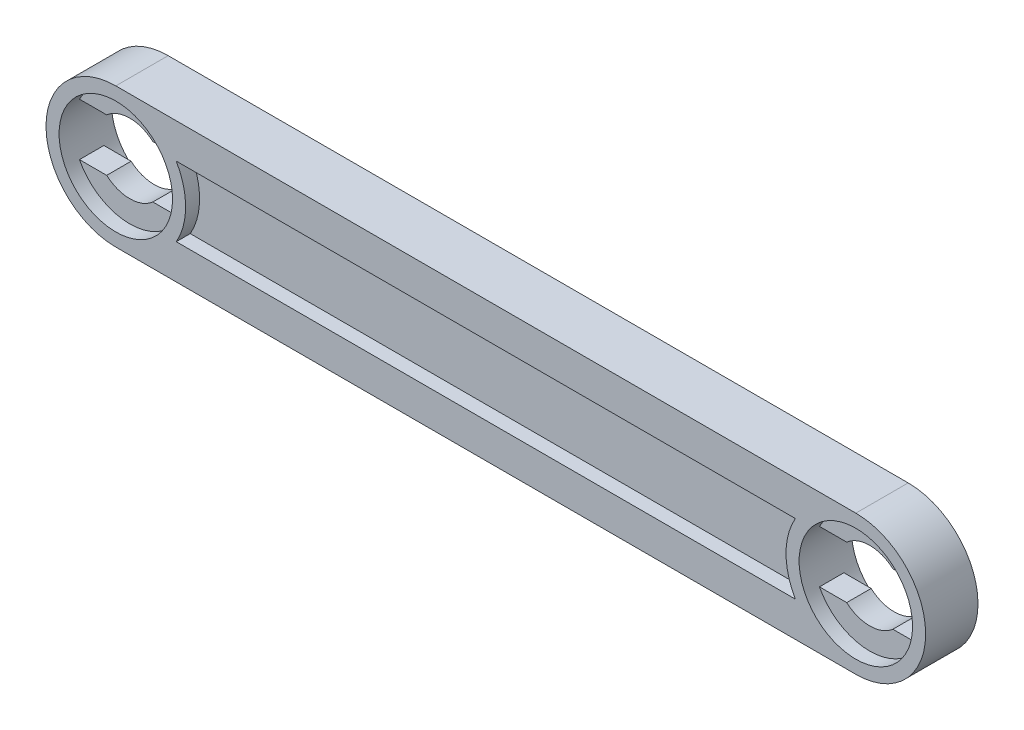
ISO-10303-21;
HEADER;
FILE_DESCRIPTION(('STEP AP214'),'2;1');
FILE_NAME('part.step','',(''),(''),'','','');
FILE_SCHEMA(('AUTOMOTIVE_DESIGN { 1 0 10303 214 1 1 1 1 }'));
ENDSEC;
DATA;
#1=APPLICATION_CONTEXT('core data for automotive mechanical design processes');
#2=APPLICATION_PROTOCOL_DEFINITION('international standard','automotive_design',2000,#1);
#3=PRODUCT_CONTEXT('',#1,'mechanical');
#4=PRODUCT('Part','Part','',(#3));
#5=PRODUCT_RELATED_PRODUCT_CATEGORY('part','',(#4));
#6=PRODUCT_DEFINITION_FORMATION('','',#4);
#7=PRODUCT_DEFINITION_CONTEXT('part definition',#1,'design');
#8=PRODUCT_DEFINITION('design','',#6,#7);
#9=PRODUCT_DEFINITION_SHAPE('','',#8);
#10=(LENGTH_UNIT() NAMED_UNIT(*) SI_UNIT(.MILLI.,.METRE.));
#11=(NAMED_UNIT(*) PLANE_ANGLE_UNIT() SI_UNIT($,.RADIAN.));
#12=(NAMED_UNIT(*) SI_UNIT($,.STERADIAN.) SOLID_ANGLE_UNIT());
#13=UNCERTAINTY_MEASURE_WITH_UNIT(LENGTH_MEASURE(1.E-05),#10,'distance_accuracy_value','');
#14=(GEOMETRIC_REPRESENTATION_CONTEXT(3) GLOBAL_UNCERTAINTY_ASSIGNED_CONTEXT((#13)) GLOBAL_UNIT_ASSIGNED_CONTEXT((#10,
#11,#12)) REPRESENTATION_CONTEXT('',''));
#15=CARTESIAN_POINT('',(0.,0.,0.));
#16=DIRECTION('',(0.,0.,1.));
#17=DIRECTION('',(1.,0.,0.));
#18=AXIS2_PLACEMENT_3D('',#15,#16,#17);
#19=CARTESIAN_POINT('',(0.,0.,-3.));
#20=DIRECTION('',(0.,0.,1.));
#21=DIRECTION('',(1.,0.,0.));
#22=AXIS2_PLACEMENT_3D('',#19,#20,#21);
#23=PLANE('',#22);
#24=DIRECTION('',(0.,-1.,0.));
#25=VECTOR('',#24,1.);
#26=CARTESIAN_POINT('',(38.4,-2.,-3.));
#27=LINE('',#26,#25);
#28=CARTESIAN_POINT('',(38.4,2.,-3.));
#29=VERTEX_POINT('',#28);
#30=CARTESIAN_POINT('',(38.4,-2.,-3.));
#31=VERTEX_POINT('',#30);
#32=EDGE_CURVE('E248',#29,#31,#27,.T.);
#33=ORIENTED_EDGE('',*,*,#32,.F.);
#34=DIRECTION('',(1.,0.,0.));
#35=VECTOR('',#34,1.);
#36=CARTESIAN_POINT('',(38.4,2.,-3.));
#37=LINE('',#36,#35);
#38=CARTESIAN_POINT('',(4.,2.,-3.));
#39=VERTEX_POINT('',#38);
#40=EDGE_CURVE('E49',#39,#29,#37,.T.);
#41=ORIENTED_EDGE('',*,*,#40,.F.);
#42=DIRECTION('',(0.,1.,0.));
#43=VECTOR('',#42,1.);
#44=CARTESIAN_POINT('',(4.00000000000003,-2.,-3.));
#45=LINE('',#44,#43);
#46=CARTESIAN_POINT('',(4.00000000000003,-2.,-3.));
#47=VERTEX_POINT('',#46);
#48=EDGE_CURVE('E239',#47,#39,#45,.T.);
#49=ORIENTED_EDGE('',*,*,#48,.F.);
#50=DIRECTION('',(-1.,0.,0.));
#51=VECTOR('',#50,1.);
#52=CARTESIAN_POINT('',(38.4,-2.,-3.));
#53=LINE('',#52,#51);
#54=EDGE_CURVE('E242',#31,#47,#53,.T.);
#55=ORIENTED_EDGE('',*,*,#54,.F.);
#56=EDGE_LOOP('',(#33,#41,#49,#55));
#57=FACE_BOUND('',#56,.T.);
#58=CARTESIAN_POINT('',(0.,0.,-3.));
#59=DIRECTION('',(0.,0.,1.));
#60=DIRECTION('',(1.,0.,0.));
#61=AXIS2_PLACEMENT_3D('',#58,#59,#60);
#62=CIRCLE('',#61,4.);
#63=CARTESIAN_POINT('',(0.,4.,-3.));
#64=VERTEX_POINT('',#63);
#65=CARTESIAN_POINT('',(0.,-4.,-3.));
#66=VERTEX_POINT('',#65);
#67=EDGE_CURVE('E414',#64,#66,#62,.T.);
#68=ORIENTED_EDGE('',*,*,#67,.F.);
#69=DIRECTION('',(-1.,0.,0.));
#70=VECTOR('',#69,1.);
#71=CARTESIAN_POINT('',(0.,4.,-3.));
#72=LINE('',#71,#70);
#73=CARTESIAN_POINT('',(42.4,4.,-3.));
#74=VERTEX_POINT('',#73);
#75=EDGE_CURVE('E424',#74,#64,#72,.T.);
#76=ORIENTED_EDGE('',*,*,#75,.F.);
#77=CARTESIAN_POINT('',(42.4,0.,-3.));
#78=DIRECTION('',(0.,0.,1.));
#79=DIRECTION('',(1.,0.,0.));
#80=AXIS2_PLACEMENT_3D('',#77,#78,#79);
#81=CIRCLE('',#80,4.);
#82=CARTESIAN_POINT('',(42.4,-4.,-3.));
#83=VERTEX_POINT('',#82);
#84=EDGE_CURVE('E421',#83,#74,#81,.T.);
#85=ORIENTED_EDGE('',*,*,#84,.F.);
#86=DIRECTION('',(1.,0.,0.));
#87=VECTOR('',#86,1.);
#88=CARTESIAN_POINT('',(0.,-4.,-3.));
#89=LINE('',#88,#87);
#90=EDGE_CURVE('E417',#66,#83,#89,.T.);
#91=ORIENTED_EDGE('',*,*,#90,.F.);
#92=EDGE_LOOP('',(#68,#76,#85,#91));
#93=FACE_BOUND('',#92,.T.);
#94=CARTESIAN_POINT('',(0.,0.,-3.));
#95=DIRECTION('',(0.,0.,1.));
#96=DIRECTION('',(1.,0.,0.));
#97=AXIS2_PLACEMENT_3D('',#94,#95,#96);
#98=CIRCLE('',#97,3.25);
#99=CARTESIAN_POINT('',(3.25,0.,-3.));
#100=VERTEX_POINT('',#99);
#101=EDGE_CURVE('E391',#100,#100,#98,.F.);
#102=ORIENTED_EDGE('',*,*,#101,.F.);
#103=EDGE_LOOP('',(#102));
#104=FACE_BOUND('',#103,.T.);
#105=CARTESIAN_POINT('',(42.4,0.,-3.));
#106=DIRECTION('',(0.,0.,1.));
#107=DIRECTION('',(1.,0.,0.));
#108=AXIS2_PLACEMENT_3D('',#105,#106,#107);
#109=CIRCLE('',#108,3.25);
#110=CARTESIAN_POINT('',(45.65,0.,-3.));
#111=VERTEX_POINT('',#110);
#112=EDGE_CURVE('E328',#111,#111,#109,.F.);
#113=ORIENTED_EDGE('',*,*,#112,.F.);
#114=EDGE_LOOP('',(#113));
#115=FACE_BOUND('',#114,.T.);
#116=ADVANCED_FACE('F34',(#57,#93,#104,#115),#23,.F.);
#117=CARTESIAN_POINT('',(39.5168593513323,1.5,-3.001));
#118=DIRECTION('',(0.,1.,0.));
#119=DIRECTION('',(0.,0.,1.));
#120=AXIS2_PLACEMENT_3D('',#117,#118,#119);
#121=PLANE('',#120);
#122=DIRECTION('',(0.,0.,1.));
#123=VECTOR('',#122,1.);
#124=CARTESIAN_POINT('',(39.5168593513323,1.5,-3.001));
#125=LINE('',#124,#123);
#126=CARTESIAN_POINT('',(39.5168593513323,1.5,-2.2));
#127=VERTEX_POINT('',#126);
#128=CARTESIAN_POINT('',(39.5168593513323,1.5,-0.8));
#129=VERTEX_POINT('',#128);
#130=EDGE_CURVE('E335',#127,#129,#125,.T.);
#131=ORIENTED_EDGE('',*,*,#130,.F.);
#132=DIRECTION('',(1.,0.,0.));
#133=VECTOR('',#132,1.);
#134=CARTESIAN_POINT('',(39.5168593513323,1.5,-2.2));
#135=LINE('',#134,#133);
#136=CARTESIAN_POINT('',(41.0771243444677,1.5,-2.2));
#137=VERTEX_POINT('',#136);
#138=EDGE_CURVE('E306',#127,#137,#135,.T.);
#139=ORIENTED_EDGE('',*,*,#138,.T.);
#140=DIRECTION('',(0.,0.,1.));
#141=VECTOR('',#140,1.);
#142=CARTESIAN_POINT('',(41.0771243444677,1.5,-3.001));
#143=LINE('',#142,#141);
#144=CARTESIAN_POINT('',(41.0771243444677,1.5,-0.8));
#145=VERTEX_POINT('',#144);
#146=EDGE_CURVE('E338',#137,#145,#143,.T.);
#147=ORIENTED_EDGE('',*,*,#146,.T.);
#148=DIRECTION('',(1.,0.,0.));
#149=VECTOR('',#148,1.);
#150=CARTESIAN_POINT('',(39.5168593513323,1.5,-0.8));
#151=LINE('',#150,#149);
#152=EDGE_CURVE('E325',#129,#145,#151,.T.);
#153=ORIENTED_EDGE('',*,*,#152,.F.);
#154=EDGE_LOOP('',(#131,#139,#147,#153));
#155=FACE_BOUND('',#154,.T.);
#156=ADVANCED_FACE('F483',(#155),#121,.F.);
#157=CARTESIAN_POINT('',(42.4,0.,-3.001));
#158=DIRECTION('',(0.,0.,1.));
#159=DIRECTION('',(1.,0.,0.));
#160=AXIS2_PLACEMENT_3D('',#157,#158,#159);
#161=CYLINDRICAL_SURFACE('',#160,2.);
#162=ORIENTED_EDGE('',*,*,#146,.F.);
#163=CARTESIAN_POINT('',(42.4,0.,-2.2));
#164=DIRECTION('',(0.,0.,1.));
#165=DIRECTION('',(1.,0.,0.));
#166=AXIS2_PLACEMENT_3D('',#163,#164,#165);
#167=CIRCLE('',#166,2.);
#168=CARTESIAN_POINT('',(43.7228756555323,1.5,-2.2));
#169=VERTEX_POINT('',#168);
#170=EDGE_CURVE('E303',#137,#169,#167,.F.);
#171=ORIENTED_EDGE('',*,*,#170,.T.);
#172=DIRECTION('',(0.,0.,1.));
#173=VECTOR('',#172,1.);
#174=CARTESIAN_POINT('',(43.7228756555323,1.5,-3.001));
#175=LINE('',#174,#173);
#176=CARTESIAN_POINT('',(43.7228756555323,1.5,-0.800000000000001));
#177=VERTEX_POINT('',#176);
#178=EDGE_CURVE('E340',#169,#177,#175,.T.);
#179=ORIENTED_EDGE('',*,*,#178,.T.);
#180=CARTESIAN_POINT('',(42.4,0.,-0.8));
#181=DIRECTION('',(0.,0.,1.));
#182=DIRECTION('',(1.,0.,0.));
#183=AXIS2_PLACEMENT_3D('',#180,#181,#182);
#184=CIRCLE('',#183,2.);
#185=EDGE_CURVE('E322',#145,#177,#184,.F.);
#186=ORIENTED_EDGE('',*,*,#185,.F.);
#187=EDGE_LOOP('',(#162,#171,#179,#186));
#188=FACE_BOUND('',#187,.T.);
#189=ADVANCED_FACE('F489',(#188),#161,.F.);
#190=CARTESIAN_POINT('',(43.7228756555323,1.5,-3.001));
#191=DIRECTION('',(0.,1.,0.));
#192=DIRECTION('',(0.,0.,1.));
#193=AXIS2_PLACEMENT_3D('',#190,#191,#192);
#194=PLANE('',#193);
#195=ORIENTED_EDGE('',*,*,#178,.F.);
#196=DIRECTION('',(1.,0.,0.));
#197=VECTOR('',#196,1.);
#198=CARTESIAN_POINT('',(43.7228756555323,1.5,-2.2));
#199=LINE('',#198,#197);
#200=CARTESIAN_POINT('',(45.2831406486677,1.5,-2.2));
#201=VERTEX_POINT('',#200);
#202=EDGE_CURVE('E300',#169,#201,#199,.T.);
#203=ORIENTED_EDGE('',*,*,#202,.T.);
#204=DIRECTION('',(0.,0.,1.));
#205=VECTOR('',#204,1.);
#206=CARTESIAN_POINT('',(45.2831406486677,1.5,-3.001));
#207=LINE('',#206,#205);
#208=CARTESIAN_POINT('',(45.2831406486677,1.5,-0.8));
#209=VERTEX_POINT('',#208);
#210=EDGE_CURVE('E342',#201,#209,#207,.T.);
#211=ORIENTED_EDGE('',*,*,#210,.T.);
#212=DIRECTION('',(1.,0.,0.));
#213=VECTOR('',#212,1.);
#214=CARTESIAN_POINT('',(43.7228756555323,1.5,-0.8));
#215=LINE('',#214,#213);
#216=EDGE_CURVE('E319',#177,#209,#215,.T.);
#217=ORIENTED_EDGE('',*,*,#216,.F.);
#218=EDGE_LOOP('',(#195,#203,#211,#217));
#219=FACE_BOUND('',#218,.T.);
#220=ADVANCED_FACE('F660',(#219),#194,.F.);
#221=CARTESIAN_POINT('',(43.7228756555323,-1.5,-3.001));
#222=DIRECTION('',(0.,-1.,0.));
#223=DIRECTION('',(0.,0.,-1.));
#224=AXIS2_PLACEMENT_3D('',#221,#222,#223);
#225=PLANE('',#224);
#226=DIRECTION('',(0.,0.,1.));
#227=VECTOR('',#226,1.);
#228=CARTESIAN_POINT('',(45.2831406486677,-1.5,-3.001));
#229=LINE('',#228,#227);
#230=CARTESIAN_POINT('',(45.2831406486677,-1.5,-2.2));
#231=VERTEX_POINT('',#230);
#232=CARTESIAN_POINT('',(45.2831406486677,-1.5,-0.8));
#233=VERTEX_POINT('',#232);
#234=EDGE_CURVE('E344',#231,#233,#229,.T.);
#235=ORIENTED_EDGE('',*,*,#234,.F.);
#236=DIRECTION('',(-1.,0.,0.));
#237=VECTOR('',#236,1.);
#238=CARTESIAN_POINT('',(43.7228756555323,-1.5,-2.2));
#239=LINE('',#238,#237);
#240=CARTESIAN_POINT('',(43.7228756555323,-1.5,-2.2));
#241=VERTEX_POINT('',#240);
#242=EDGE_CURVE('E297',#231,#241,#239,.T.);
#243=ORIENTED_EDGE('',*,*,#242,.T.);
#244=DIRECTION('',(0.,0.,1.));
#245=VECTOR('',#244,1.);
#246=CARTESIAN_POINT('',(43.7228756555323,-1.5,-3.001));
#247=LINE('',#246,#245);
#248=CARTESIAN_POINT('',(43.7228756555323,-1.5,-0.8));
#249=VERTEX_POINT('',#248);
#250=EDGE_CURVE('E346',#241,#249,#247,.T.);
#251=ORIENTED_EDGE('',*,*,#250,.T.);
#252=DIRECTION('',(-1.,0.,0.));
#253=VECTOR('',#252,1.);
#254=CARTESIAN_POINT('',(43.7228756555323,-1.5,-0.8));
#255=LINE('',#254,#253);
#256=EDGE_CURVE('E316',#233,#249,#255,.T.);
#257=ORIENTED_EDGE('',*,*,#256,.F.);
#258=EDGE_LOOP('',(#235,#243,#251,#257));
#259=FACE_BOUND('',#258,.T.);
#260=ADVANCED_FACE('F670',(#259),#225,.F.);
#261=CARTESIAN_POINT('',(42.4,0.,-3.001));
#262=DIRECTION('',(0.,0.,1.));
#263=DIRECTION('',(1.,0.,0.));
#264=AXIS2_PLACEMENT_3D('',#261,#262,#263);
#265=CYLINDRICAL_SURFACE('',#264,2.);
#266=ORIENTED_EDGE('',*,*,#250,.F.);
#267=CARTESIAN_POINT('',(42.4,0.,-2.2));
#268=DIRECTION('',(0.,0.,1.));
#269=DIRECTION('',(1.,0.,0.));
#270=AXIS2_PLACEMENT_3D('',#267,#268,#269);
#271=CIRCLE('',#270,2.);
#272=CARTESIAN_POINT('',(41.0771243444677,-1.5,-2.2));
#273=VERTEX_POINT('',#272);
#274=EDGE_CURVE('E294',#241,#273,#271,.F.);
#275=ORIENTED_EDGE('',*,*,#274,.T.);
#276=DIRECTION('',(0.,0.,1.));
#277=VECTOR('',#276,1.);
#278=CARTESIAN_POINT('',(41.0771243444677,-1.5,-3.001));
#279=LINE('',#278,#277);
#280=CARTESIAN_POINT('',(41.0771243444677,-1.5,-0.800000000000001));
#281=VERTEX_POINT('',#280);
#282=EDGE_CURVE('E348',#273,#281,#279,.T.);
#283=ORIENTED_EDGE('',*,*,#282,.T.);
#284=CARTESIAN_POINT('',(42.4,0.,-0.8));
#285=DIRECTION('',(0.,0.,1.));
#286=DIRECTION('',(1.,0.,0.));
#287=AXIS2_PLACEMENT_3D('',#284,#285,#286);
#288=CIRCLE('',#287,2.);
#289=EDGE_CURVE('E313',#249,#281,#288,.F.);
#290=ORIENTED_EDGE('',*,*,#289,.F.);
#291=EDGE_LOOP('',(#266,#275,#283,#290));
#292=FACE_BOUND('',#291,.T.);
#293=ADVANCED_FACE('F680',(#292),#265,.F.);
#294=CARTESIAN_POINT('',(39.5168593513323,-1.5,-3.001));
#295=DIRECTION('',(0.,-1.,0.));
#296=DIRECTION('',(0.,0.,-1.));
#297=AXIS2_PLACEMENT_3D('',#294,#295,#296);
#298=PLANE('',#297);
#299=ORIENTED_EDGE('',*,*,#282,.F.);
#300=DIRECTION('',(-1.,0.,0.));
#301=VECTOR('',#300,1.);
#302=CARTESIAN_POINT('',(39.5168593513323,-1.5,-2.2));
#303=LINE('',#302,#301);
#304=CARTESIAN_POINT('',(39.5168593513323,-1.5,-2.2));
#305=VERTEX_POINT('',#304);
#306=EDGE_CURVE('E291',#273,#305,#303,.T.);
#307=ORIENTED_EDGE('',*,*,#306,.T.);
#308=DIRECTION('',(0.,0.,1.));
#309=VECTOR('',#308,1.);
#310=CARTESIAN_POINT('',(39.5168593513323,-1.5,-3.001));
#311=LINE('',#310,#309);
#312=CARTESIAN_POINT('',(39.5168593513323,-1.5,-0.8));
#313=VERTEX_POINT('',#312);
#314=EDGE_CURVE('E334',#305,#313,#311,.T.);
#315=ORIENTED_EDGE('',*,*,#314,.T.);
#316=DIRECTION('',(-1.,0.,0.));
#317=VECTOR('',#316,1.);
#318=CARTESIAN_POINT('',(39.5168593513323,-1.5,-0.8));
#319=LINE('',#318,#317);
#320=EDGE_CURVE('E11',#281,#313,#319,.T.);
#321=ORIENTED_EDGE('',*,*,#320,.F.);
#322=EDGE_LOOP('',(#299,#307,#315,#321));
#323=FACE_BOUND('',#322,.T.);
#324=ADVANCED_FACE('F602',(#323),#298,.F.);
#325=CARTESIAN_POINT('',(-2.8831406486677,1.5,-3.001));
#326=DIRECTION('',(0.,1.,0.));
#327=DIRECTION('',(0.,0.,1.));
#328=AXIS2_PLACEMENT_3D('',#325,#326,#327);
#329=PLANE('',#328);
#330=DIRECTION('',(0.,0.,1.));
#331=VECTOR('',#330,1.);
#332=CARTESIAN_POINT('',(-2.8831406486677,1.5,-3.001));
#333=LINE('',#332,#331);
#334=CARTESIAN_POINT('',(-2.8831406486677,1.5,-2.2));
#335=VERTEX_POINT('',#334);
#336=CARTESIAN_POINT('',(-2.8831406486677,1.5,-0.8));
#337=VERTEX_POINT('',#336);
#338=EDGE_CURVE('E398',#335,#337,#333,.T.);
#339=ORIENTED_EDGE('',*,*,#338,.F.);
#340=DIRECTION('',(1.,0.,0.));
#341=VECTOR('',#340,1.);
#342=CARTESIAN_POINT('',(-2.8831406486677,1.5,-2.2));
#343=LINE('',#342,#341);
#344=CARTESIAN_POINT('',(-1.3228756555323,1.5,-2.2));
#345=VERTEX_POINT('',#344);
#346=EDGE_CURVE('E369',#335,#345,#343,.T.);
#347=ORIENTED_EDGE('',*,*,#346,.T.);
#348=DIRECTION('',(0.,0.,1.));
#349=VECTOR('',#348,1.);
#350=CARTESIAN_POINT('',(-1.3228756555323,1.5,-3.001));
#351=LINE('',#350,#349);
#352=CARTESIAN_POINT('',(-1.3228756555323,1.5,-0.8));
#353=VERTEX_POINT('',#352);
#354=EDGE_CURVE('E401',#345,#353,#351,.T.);
#355=ORIENTED_EDGE('',*,*,#354,.T.);
#356=DIRECTION('',(1.,0.,0.));
#357=VECTOR('',#356,1.);
#358=CARTESIAN_POINT('',(-2.8831406486677,1.5,-0.8));
#359=LINE('',#358,#357);
#360=EDGE_CURVE('E388',#337,#353,#359,.T.);
#361=ORIENTED_EDGE('',*,*,#360,.F.);
#362=EDGE_LOOP('',(#339,#347,#355,#361));
#363=FACE_BOUND('',#362,.T.);
#364=ADVANCED_FACE('F538',(#363),#329,.F.);
#365=CARTESIAN_POINT('',(0.,0.,-3.001));
#366=DIRECTION('',(0.,0.,1.));
#367=DIRECTION('',(1.,0.,0.));
#368=AXIS2_PLACEMENT_3D('',#365,#366,#367);
#369=CYLINDRICAL_SURFACE('',#368,2.);
#370=ORIENTED_EDGE('',*,*,#354,.F.);
#371=CARTESIAN_POINT('',(0.,0.,-2.2));
#372=DIRECTION('',(0.,0.,1.));
#373=DIRECTION('',(1.,0.,0.));
#374=AXIS2_PLACEMENT_3D('',#371,#372,#373);
#375=CIRCLE('',#374,2.);
#376=CARTESIAN_POINT('',(1.3228756555323,1.5,-2.2));
#377=VERTEX_POINT('',#376);
#378=EDGE_CURVE('E366',#345,#377,#375,.F.);
#379=ORIENTED_EDGE('',*,*,#378,.T.);
#380=DIRECTION('',(0.,0.,1.));
#381=VECTOR('',#380,1.);
#382=CARTESIAN_POINT('',(1.3228756555323,1.5,-3.001));
#383=LINE('',#382,#381);
#384=CARTESIAN_POINT('',(1.3228756555323,1.5,-0.800000000000001));
#385=VERTEX_POINT('',#384);
#386=EDGE_CURVE('E403',#377,#385,#383,.T.);
#387=ORIENTED_EDGE('',*,*,#386,.T.);
#388=CARTESIAN_POINT('',(0.,0.,-0.8));
#389=DIRECTION('',(0.,0.,1.));
#390=DIRECTION('',(1.,0.,0.));
#391=AXIS2_PLACEMENT_3D('',#388,#389,#390);
#392=CIRCLE('',#391,2.);
#393=EDGE_CURVE('E385',#353,#385,#392,.F.);
#394=ORIENTED_EDGE('',*,*,#393,.F.);
#395=EDGE_LOOP('',(#370,#379,#387,#394));
#396=FACE_BOUND('',#395,.T.);
#397=ADVANCED_FACE('F544',(#396),#369,.F.);
#398=CARTESIAN_POINT('',(1.3228756555323,1.5,-3.001));
#399=DIRECTION('',(0.,1.,0.));
#400=DIRECTION('',(0.,0.,1.));
#401=AXIS2_PLACEMENT_3D('',#398,#399,#400);
#402=PLANE('',#401);
#403=ORIENTED_EDGE('',*,*,#386,.F.);
#404=DIRECTION('',(1.,0.,0.));
#405=VECTOR('',#404,1.);
#406=CARTESIAN_POINT('',(1.3228756555323,1.5,-2.2));
#407=LINE('',#406,#405);
#408=CARTESIAN_POINT('',(2.8831406486677,1.5,-2.2));
#409=VERTEX_POINT('',#408);
#410=EDGE_CURVE('E363',#377,#409,#407,.T.);
#411=ORIENTED_EDGE('',*,*,#410,.T.);
#412=DIRECTION('',(0.,0.,1.));
#413=VECTOR('',#412,1.);
#414=CARTESIAN_POINT('',(2.8831406486677,1.5,-3.001));
#415=LINE('',#414,#413);
#416=CARTESIAN_POINT('',(2.8831406486677,1.5,-0.8));
#417=VERTEX_POINT('',#416);
#418=EDGE_CURVE('E405',#409,#417,#415,.T.);
#419=ORIENTED_EDGE('',*,*,#418,.T.);
#420=DIRECTION('',(1.,0.,0.));
#421=VECTOR('',#420,1.);
#422=CARTESIAN_POINT('',(1.3228756555323,1.5,-0.8));
#423=LINE('',#422,#421);
#424=EDGE_CURVE('E382',#385,#417,#423,.T.);
#425=ORIENTED_EDGE('',*,*,#424,.F.);
#426=EDGE_LOOP('',(#403,#411,#419,#425));
#427=FACE_BOUND('',#426,.T.);
#428=ADVANCED_FACE('F547',(#427),#402,.F.);
#429=CARTESIAN_POINT('',(1.3228756555323,-1.5,-3.001));
#430=DIRECTION('',(0.,-1.,0.));
#431=DIRECTION('',(0.,0.,-1.));
#432=AXIS2_PLACEMENT_3D('',#429,#430,#431);
#433=PLANE('',#432);
#434=DIRECTION('',(0.,0.,1.));
#435=VECTOR('',#434,1.);
#436=CARTESIAN_POINT('',(2.8831406486677,-1.5,-3.001));
#437=LINE('',#436,#435);
#438=CARTESIAN_POINT('',(2.8831406486677,-1.5,-2.2));
#439=VERTEX_POINT('',#438);
#440=CARTESIAN_POINT('',(2.8831406486677,-1.5,-0.8));
#441=VERTEX_POINT('',#440);
#442=EDGE_CURVE('E407',#439,#441,#437,.T.);
#443=ORIENTED_EDGE('',*,*,#442,.F.);
#444=DIRECTION('',(-1.,0.,0.));
#445=VECTOR('',#444,1.);
#446=CARTESIAN_POINT('',(1.3228756555323,-1.5,-2.2));
#447=LINE('',#446,#445);
#448=CARTESIAN_POINT('',(1.32287565553229,-1.5,-2.2));
#449=VERTEX_POINT('',#448);
#450=EDGE_CURVE('E360',#439,#449,#447,.T.);
#451=ORIENTED_EDGE('',*,*,#450,.T.);
#452=DIRECTION('',(0.,0.,1.));
#453=VECTOR('',#452,1.);
#454=CARTESIAN_POINT('',(1.32287565553229,-1.5,-3.001));
#455=LINE('',#454,#453);
#456=CARTESIAN_POINT('',(1.32287565553229,-1.5,-0.8));
#457=VERTEX_POINT('',#456);
#458=EDGE_CURVE('E409',#449,#457,#455,.T.);
#459=ORIENTED_EDGE('',*,*,#458,.T.);
#460=DIRECTION('',(-1.,0.,0.));
#461=VECTOR('',#460,1.);
#462=CARTESIAN_POINT('',(1.3228756555323,-1.5,-0.8));
#463=LINE('',#462,#461);
#464=EDGE_CURVE('E379',#441,#457,#463,.T.);
#465=ORIENTED_EDGE('',*,*,#464,.F.);
#466=EDGE_LOOP('',(#443,#451,#459,#465));
#467=FACE_BOUND('',#466,.T.);
#468=ADVANCED_FACE('F461',(#467),#433,.F.);
#469=CARTESIAN_POINT('',(0.,0.,-3.001));
#470=DIRECTION('',(0.,0.,1.));
#471=DIRECTION('',(1.,0.,0.));
#472=AXIS2_PLACEMENT_3D('',#469,#470,#471);
#473=CYLINDRICAL_SURFACE('',#472,2.);
#474=ORIENTED_EDGE('',*,*,#458,.F.);
#475=CARTESIAN_POINT('',(0.,0.,-2.2));
#476=DIRECTION('',(0.,0.,1.));
#477=DIRECTION('',(1.,0.,0.));
#478=AXIS2_PLACEMENT_3D('',#475,#476,#477);
#479=CIRCLE('',#478,2.);
#480=CARTESIAN_POINT('',(-1.3228756555323,-1.5,-2.2));
#481=VERTEX_POINT('',#480);
#482=EDGE_CURVE('E357',#449,#481,#479,.F.);
#483=ORIENTED_EDGE('',*,*,#482,.T.);
#484=DIRECTION('',(0.,0.,1.));
#485=VECTOR('',#484,1.);
#486=CARTESIAN_POINT('',(-1.3228756555323,-1.5,-3.001));
#487=LINE('',#486,#485);
#488=CARTESIAN_POINT('',(-1.3228756555323,-1.5,-0.800000000000001));
#489=VERTEX_POINT('',#488);
#490=EDGE_CURVE('E411',#481,#489,#487,.T.);
#491=ORIENTED_EDGE('',*,*,#490,.T.);
#492=CARTESIAN_POINT('',(0.,0.,-0.8));
#493=DIRECTION('',(0.,0.,1.));
#494=DIRECTION('',(1.,0.,0.));
#495=AXIS2_PLACEMENT_3D('',#492,#493,#494);
#496=CIRCLE('',#495,2.);
#497=EDGE_CURVE('E376',#457,#489,#496,.F.);
#498=ORIENTED_EDGE('',*,*,#497,.F.);
#499=EDGE_LOOP('',(#474,#483,#491,#498));
#500=FACE_BOUND('',#499,.T.);
#501=ADVANCED_FACE('F464',(#500),#473,.F.);
#502=CARTESIAN_POINT('',(-2.8831406486677,-1.5,-3.001));
#503=DIRECTION('',(0.,-1.,0.));
#504=DIRECTION('',(0.,0.,-1.));
#505=AXIS2_PLACEMENT_3D('',#502,#503,#504);
#506=PLANE('',#505);
#507=ORIENTED_EDGE('',*,*,#490,.F.);
#508=DIRECTION('',(-1.,0.,0.));
#509=VECTOR('',#508,1.);
#510=CARTESIAN_POINT('',(-2.8831406486677,-1.5,-2.2));
#511=LINE('',#510,#509);
#512=CARTESIAN_POINT('',(-2.8831406486677,-1.5,-2.2));
#513=VERTEX_POINT('',#512);
#514=EDGE_CURVE('E354',#481,#513,#511,.T.);
#515=ORIENTED_EDGE('',*,*,#514,.T.);
#516=DIRECTION('',(0.,0.,1.));
#517=VECTOR('',#516,1.);
#518=CARTESIAN_POINT('',(-2.8831406486677,-1.5,-3.001));
#519=LINE('',#518,#517);
#520=CARTESIAN_POINT('',(-2.8831406486677,-1.5,-0.8));
#521=VERTEX_POINT('',#520);
#522=EDGE_CURVE('E397',#513,#521,#519,.T.);
#523=ORIENTED_EDGE('',*,*,#522,.T.);
#524=DIRECTION('',(-1.,0.,0.));
#525=VECTOR('',#524,1.);
#526=CARTESIAN_POINT('',(-2.8831406486677,-1.5,-0.8));
#527=LINE('',#526,#525);
#528=EDGE_CURVE('E42',#489,#521,#527,.T.);
#529=ORIENTED_EDGE('',*,*,#528,.F.);
#530=EDGE_LOOP('',(#507,#515,#523,#529));
#531=FACE_BOUND('',#530,.T.);
#532=ADVANCED_FACE('F465',(#531),#506,.F.);
#533=CARTESIAN_POINT('',(0.,0.,-3.));
#534=DIRECTION('',(0.,0.,1.));
#535=DIRECTION('',(1.,0.,0.));
#536=AXIS2_PLACEMENT_3D('',#533,#534,#535);
#537=CYLINDRICAL_SURFACE('',#536,4.);
#538=CARTESIAN_POINT('',(0.,0.,0.));
#539=DIRECTION('',(0.,0.,1.));
#540=DIRECTION('',(1.,0.,0.));
#541=AXIS2_PLACEMENT_3D('',#538,#539,#540);
#542=CIRCLE('',#541,4.);
#543=CARTESIAN_POINT('',(0.,4.,0.));
#544=VERTEX_POINT('',#543);
#545=CARTESIAN_POINT('',(0.,-4.,0.));
#546=VERTEX_POINT('',#545);
#547=EDGE_CURVE('E400',#544,#546,#542,.T.);
#548=ORIENTED_EDGE('',*,*,#547,.F.);
#549=DIRECTION('',(0.,0.,1.));
#550=VECTOR('',#549,1.);
#551=CARTESIAN_POINT('',(0.,4.,-3.));
#552=LINE('',#551,#550);
#553=EDGE_CURVE('E438',#64,#544,#552,.T.);
#554=ORIENTED_EDGE('',*,*,#553,.F.);
#555=ORIENTED_EDGE('',*,*,#67,.T.);
#556=DIRECTION('',(0.,0.,1.));
#557=VECTOR('',#556,1.);
#558=CARTESIAN_POINT('',(0.,-4.,-3.));
#559=LINE('',#558,#557);
#560=EDGE_CURVE('E427',#66,#546,#559,.T.);
#561=ORIENTED_EDGE('',*,*,#560,.T.);
#562=EDGE_LOOP('',(#548,#554,#555,#561));
#563=FACE_BOUND('',#562,.T.);
#564=ADVANCED_FACE('F36',(#563),#537,.T.);
#565=CARTESIAN_POINT('',(0.,4.,-3.));
#566=DIRECTION('',(0.,1.,0.));
#567=DIRECTION('',(0.,0.,1.));
#568=AXIS2_PLACEMENT_3D('',#565,#566,#567);
#569=PLANE('',#568);
#570=DIRECTION('',(-1.,0.,0.));
#571=VECTOR('',#570,1.);
#572=CARTESIAN_POINT('',(0.,4.,0.));
#573=LINE('',#572,#571);
#574=CARTESIAN_POINT('',(42.4,4.,0.));
#575=VERTEX_POINT('',#574);
#576=EDGE_CURVE('E418',#575,#544,#573,.T.);
#577=ORIENTED_EDGE('',*,*,#576,.F.);
#578=DIRECTION('',(0.,0.,1.));
#579=VECTOR('',#578,1.);
#580=CARTESIAN_POINT('',(42.4,4.,-3.));
#581=LINE('',#580,#579);
#582=EDGE_CURVE('E440',#74,#575,#581,.T.);
#583=ORIENTED_EDGE('',*,*,#582,.F.);
#584=ORIENTED_EDGE('',*,*,#75,.T.);
#585=ORIENTED_EDGE('',*,*,#553,.T.);
#586=EDGE_LOOP('',(#577,#583,#584,#585));
#587=FACE_BOUND('',#586,.T.);
#588=ADVANCED_FACE('F501',(#587),#569,.T.);
#589=CARTESIAN_POINT('',(42.4,0.,-3.));
#590=DIRECTION('',(0.,0.,1.));
#591=DIRECTION('',(1.,0.,0.));
#592=AXIS2_PLACEMENT_3D('',#589,#590,#591);
#593=CYLINDRICAL_SURFACE('',#592,4.);
#594=CARTESIAN_POINT('',(42.4,0.,0.));
#595=DIRECTION('',(0.,0.,1.));
#596=DIRECTION('',(1.,0.,0.));
#597=AXIS2_PLACEMENT_3D('',#594,#595,#596);
#598=CIRCLE('',#597,4.);
#599=CARTESIAN_POINT('',(42.4,-4.,0.));
#600=VERTEX_POINT('',#599);
#601=EDGE_CURVE('E433',#600,#575,#598,.T.);
#602=ORIENTED_EDGE('',*,*,#601,.F.);
#603=DIRECTION('',(0.,0.,1.));
#604=VECTOR('',#603,1.);
#605=CARTESIAN_POINT('',(42.4,-4.,-3.));
#606=LINE('',#605,#604);
#607=EDGE_CURVE('E442',#83,#600,#606,.T.);
#608=ORIENTED_EDGE('',*,*,#607,.F.);
#609=ORIENTED_EDGE('',*,*,#84,.T.);
#610=ORIENTED_EDGE('',*,*,#582,.T.);
#611=EDGE_LOOP('',(#602,#608,#609,#610));
#612=FACE_BOUND('',#611,.T.);
#613=ADVANCED_FACE('F504',(#612),#593,.T.);
#614=CARTESIAN_POINT('',(0.,-4.,-3.));
#615=DIRECTION('',(0.,-1.,0.));
#616=DIRECTION('',(0.,0.,-1.));
#617=AXIS2_PLACEMENT_3D('',#614,#615,#616);
#618=PLANE('',#617);
#619=DIRECTION('',(1.,0.,0.));
#620=VECTOR('',#619,1.);
#621=CARTESIAN_POINT('',(0.,-4.,0.));
#622=LINE('',#621,#620);
#623=EDGE_CURVE('E430',#546,#600,#622,.T.);
#624=ORIENTED_EDGE('',*,*,#623,.F.);
#625=ORIENTED_EDGE('',*,*,#560,.F.);
#626=ORIENTED_EDGE('',*,*,#90,.T.);
#627=ORIENTED_EDGE('',*,*,#607,.T.);
#628=EDGE_LOOP('',(#624,#625,#626,#627));
#629=FACE_BOUND('',#628,.T.);
#630=ADVANCED_FACE('F499',(#629),#618,.T.);
#631=CARTESIAN_POINT('',(0.,0.,0.));
#632=DIRECTION('',(0.,0.,1.));
#633=DIRECTION('',(1.,0.,0.));
#634=AXIS2_PLACEMENT_3D('',#631,#632,#633);
#635=PLANE('',#634);
#636=CARTESIAN_POINT('',(0.,0.,0.));
#637=DIRECTION('',(0.,0.,-1.));
#638=DIRECTION('',(1.,0.,0.));
#639=AXIS2_PLACEMENT_3D('',#636,#637,#638);
#640=CIRCLE('',#639,4.);
#641=CARTESIAN_POINT('',(3.46410161513775,2.,0.));
#642=VERTEX_POINT('',#641);
#643=CARTESIAN_POINT('',(3.46410161513775,-2.,0.));
#644=VERTEX_POINT('',#643);
#645=EDGE_CURVE('E57',#642,#644,#640,.T.);
#646=ORIENTED_EDGE('',*,*,#645,.F.);
#647=DIRECTION('',(-1.,0.,0.));
#648=VECTOR('',#647,1.);
#649=CARTESIAN_POINT('',(3.46410161513775,2.,0.));
#650=LINE('',#649,#648);
#651=CARTESIAN_POINT('',(38.9358983848622,2.,0.));
#652=VERTEX_POINT('',#651);
#653=EDGE_CURVE('E261',#652,#642,#650,.T.);
#654=ORIENTED_EDGE('',*,*,#653,.F.);
#655=CARTESIAN_POINT('',(42.4,0.,0.));
#656=DIRECTION('',(0.,0.,-1.));
#657=DIRECTION('',(1.,0.,0.));
#658=AXIS2_PLACEMENT_3D('',#655,#656,#657);
#659=CIRCLE('',#658,4.);
#660=CARTESIAN_POINT('',(38.9358983848622,-2.,0.));
#661=VERTEX_POINT('',#660);
#662=EDGE_CURVE('E275',#661,#652,#659,.T.);
#663=ORIENTED_EDGE('',*,*,#662,.F.);
#664=DIRECTION('',(1.,0.,0.));
#665=VECTOR('',#664,1.);
#666=CARTESIAN_POINT('',(3.46410161513775,-2.,0.));
#667=LINE('',#666,#665);
#668=EDGE_CURVE('E272',#644,#661,#667,.T.);
#669=ORIENTED_EDGE('',*,*,#668,.F.);
#670=EDGE_LOOP('',(#646,#654,#663,#669));
#671=FACE_BOUND('',#670,.T.);
#672=CARTESIAN_POINT('',(42.4,0.,0.));
#673=DIRECTION('',(0.,0.,1.));
#674=DIRECTION('',(1.,0.,0.));
#675=AXIS2_PLACEMENT_3D('',#672,#673,#674);
#676=CIRCLE('',#675,3.25);
#677=CARTESIAN_POINT('',(45.65,0.,0.));
#678=VERTEX_POINT('',#677);
#679=EDGE_CURVE('E331',#678,#678,#676,.T.);
#680=ORIENTED_EDGE('',*,*,#679,.F.);
#681=EDGE_LOOP('',(#680));
#682=FACE_BOUND('',#681,.T.);
#683=CARTESIAN_POINT('',(0.,0.,0.));
#684=DIRECTION('',(0.,0.,1.));
#685=DIRECTION('',(1.,0.,0.));
#686=AXIS2_PLACEMENT_3D('',#683,#684,#685);
#687=CIRCLE('',#686,3.25);
#688=CARTESIAN_POINT('',(3.25,0.,0.));
#689=VERTEX_POINT('',#688);
#690=EDGE_CURVE('E394',#689,#689,#687,.T.);
#691=ORIENTED_EDGE('',*,*,#690,.F.);
#692=EDGE_LOOP('',(#691));
#693=FACE_BOUND('',#692,.T.);
#694=ORIENTED_EDGE('',*,*,#547,.T.);
#695=ORIENTED_EDGE('',*,*,#623,.T.);
#696=ORIENTED_EDGE('',*,*,#601,.T.);
#697=ORIENTED_EDGE('',*,*,#576,.T.);
#698=EDGE_LOOP('',(#694,#695,#696,#697));
#699=FACE_BOUND('',#698,.T.);
#700=ADVANCED_FACE('F496',(#671,#682,#693,#699),#635,.T.);
#701=CARTESIAN_POINT('',(0.,0.,-3.001));
#702=DIRECTION('',(0.,0.,1.));
#703=DIRECTION('',(1.,0.,0.));
#704=AXIS2_PLACEMENT_3D('',#701,#702,#703);
#705=CYLINDRICAL_SURFACE('',#704,3.25);
#706=CARTESIAN_POINT('',(0.,0.,-2.2));
#707=DIRECTION('',(0.,0.,1.));
#708=DIRECTION('',(1.,0.,0.));
#709=AXIS2_PLACEMENT_3D('',#706,#707,#708);
#710=CIRCLE('',#709,3.25);
#711=EDGE_CURVE('E351',#409,#335,#710,.T.);
#712=ORIENTED_EDGE('',*,*,#711,.T.);
#713=ORIENTED_EDGE('',*,*,#338,.T.);
#714=CARTESIAN_POINT('',(0.,0.,-0.8));
#715=DIRECTION('',(0.,0.,1.));
#716=DIRECTION('',(1.,0.,0.));
#717=AXIS2_PLACEMENT_3D('',#714,#715,#716);
#718=CIRCLE('',#717,3.25);
#719=EDGE_CURVE('E373',#417,#337,#718,.T.);
#720=ORIENTED_EDGE('',*,*,#719,.F.);
#721=ORIENTED_EDGE('',*,*,#418,.F.);
#722=EDGE_LOOP('',(#712,#713,#720,#721));
#723=FACE_BOUND('',#722,.T.);
#724=EDGE_CURVE('E337',#513,#439,#710,.T.);
#725=ORIENTED_EDGE('',*,*,#724,.T.);
#726=ORIENTED_EDGE('',*,*,#442,.T.);
#727=EDGE_CURVE('E372',#521,#441,#718,.T.);
#728=ORIENTED_EDGE('',*,*,#727,.F.);
#729=ORIENTED_EDGE('',*,*,#522,.F.);
#730=EDGE_LOOP('',(#725,#726,#728,#729));
#731=FACE_BOUND('',#730,.T.);
#732=ORIENTED_EDGE('',*,*,#690,.T.);
#733=EDGE_LOOP('',(#732));
#734=FACE_BOUND('',#733,.T.);
#735=ORIENTED_EDGE('',*,*,#101,.T.);
#736=EDGE_LOOP('',(#735));
#737=FACE_BOUND('',#736,.T.);
#738=ADVANCED_FACE('F457',(#723,#731,#734,#737),#705,.F.);
#739=CARTESIAN_POINT('',(0.,0.,-0.8));
#740=DIRECTION('',(0.,0.,1.));
#741=DIRECTION('',(1.,0.,0.));
#742=AXIS2_PLACEMENT_3D('',#739,#740,#741);
#743=PLANE('',#742);
#744=ORIENTED_EDGE('',*,*,#464,.T.);
#745=ORIENTED_EDGE('',*,*,#497,.T.);
#746=ORIENTED_EDGE('',*,*,#528,.T.);
#747=ORIENTED_EDGE('',*,*,#727,.T.);
#748=EDGE_LOOP('',(#744,#745,#746,#747));
#749=FACE_BOUND('',#748,.T.);
#750=ADVANCED_FACE('F449',(#749),#743,.T.);
#751=ORIENTED_EDGE('',*,*,#360,.T.);
#752=ORIENTED_EDGE('',*,*,#393,.T.);
#753=ORIENTED_EDGE('',*,*,#424,.T.);
#754=ORIENTED_EDGE('',*,*,#719,.T.);
#755=EDGE_LOOP('',(#751,#752,#753,#754));
#756=FACE_BOUND('',#755,.T.);
#757=ADVANCED_FACE('F479',(#756),#743,.T.);
#758=CARTESIAN_POINT('',(0.,0.,-2.2));
#759=DIRECTION('',(0.,0.,1.));
#760=DIRECTION('',(1.,0.,0.));
#761=AXIS2_PLACEMENT_3D('',#758,#759,#760);
#762=PLANE('',#761);
#763=ORIENTED_EDGE('',*,*,#711,.F.);
#764=ORIENTED_EDGE('',*,*,#410,.F.);
#765=ORIENTED_EDGE('',*,*,#378,.F.);
#766=ORIENTED_EDGE('',*,*,#346,.F.);
#767=EDGE_LOOP('',(#763,#764,#765,#766));
#768=FACE_BOUND('',#767,.T.);
#769=ADVANCED_FACE('F470',(#768),#762,.F.);
#770=ORIENTED_EDGE('',*,*,#724,.F.);
#771=ORIENTED_EDGE('',*,*,#514,.F.);
#772=ORIENTED_EDGE('',*,*,#482,.F.);
#773=ORIENTED_EDGE('',*,*,#450,.F.);
#774=EDGE_LOOP('',(#770,#771,#772,#773));
#775=FACE_BOUND('',#774,.T.);
#776=ADVANCED_FACE('F467',(#775),#762,.F.);
#777=CARTESIAN_POINT('',(42.4,0.,-3.001));
#778=DIRECTION('',(0.,0.,1.));
#779=DIRECTION('',(1.,0.,0.));
#780=AXIS2_PLACEMENT_3D('',#777,#778,#779);
#781=CYLINDRICAL_SURFACE('',#780,3.25);
#782=CARTESIAN_POINT('',(42.4,0.,-2.2));
#783=DIRECTION('',(0.,0.,1.));
#784=DIRECTION('',(1.,0.,0.));
#785=AXIS2_PLACEMENT_3D('',#782,#783,#784);
#786=CIRCLE('',#785,3.25);
#787=EDGE_CURVE('E288',#201,#127,#786,.T.);
#788=ORIENTED_EDGE('',*,*,#787,.T.);
#789=ORIENTED_EDGE('',*,*,#130,.T.);
#790=CARTESIAN_POINT('',(42.4,0.,-0.8));
#791=DIRECTION('',(0.,0.,1.));
#792=DIRECTION('',(1.,0.,0.));
#793=AXIS2_PLACEMENT_3D('',#790,#791,#792);
#794=CIRCLE('',#793,3.25);
#795=EDGE_CURVE('E310',#209,#129,#794,.T.);
#796=ORIENTED_EDGE('',*,*,#795,.F.);
#797=ORIENTED_EDGE('',*,*,#210,.F.);
#798=EDGE_LOOP('',(#788,#789,#796,#797));
#799=FACE_BOUND('',#798,.T.);
#800=EDGE_CURVE('E282',#305,#231,#786,.T.);
#801=ORIENTED_EDGE('',*,*,#800,.T.);
#802=ORIENTED_EDGE('',*,*,#234,.T.);
#803=EDGE_CURVE('E309',#313,#233,#794,.T.);
#804=ORIENTED_EDGE('',*,*,#803,.F.);
#805=ORIENTED_EDGE('',*,*,#314,.F.);
#806=EDGE_LOOP('',(#801,#802,#804,#805));
#807=FACE_BOUND('',#806,.T.);
#808=ORIENTED_EDGE('',*,*,#679,.T.);
#809=EDGE_LOOP('',(#808));
#810=FACE_BOUND('',#809,.T.);
#811=ORIENTED_EDGE('',*,*,#112,.T.);
#812=EDGE_LOOP('',(#811));
#813=FACE_BOUND('',#812,.T.);
#814=ADVANCED_FACE('F469',(#799,#807,#810,#813),#781,.F.);
#815=CARTESIAN_POINT('',(42.4,0.,-0.8));
#816=DIRECTION('',(0.,0.,1.));
#817=DIRECTION('',(1.,0.,0.));
#818=AXIS2_PLACEMENT_3D('',#815,#816,#817);
#819=PLANE('',#818);
#820=ORIENTED_EDGE('',*,*,#256,.T.);
#821=ORIENTED_EDGE('',*,*,#289,.T.);
#822=ORIENTED_EDGE('',*,*,#320,.T.);
#823=ORIENTED_EDGE('',*,*,#803,.T.);
#824=EDGE_LOOP('',(#820,#821,#822,#823));
#825=FACE_BOUND('',#824,.T.);
#826=ADVANCED_FACE('F476',(#825),#819,.T.);
#827=ORIENTED_EDGE('',*,*,#152,.T.);
#828=ORIENTED_EDGE('',*,*,#185,.T.);
#829=ORIENTED_EDGE('',*,*,#216,.T.);
#830=ORIENTED_EDGE('',*,*,#795,.T.);
#831=EDGE_LOOP('',(#827,#828,#829,#830));
#832=FACE_BOUND('',#831,.T.);
#833=ADVANCED_FACE('F716',(#832),#819,.T.);
#834=CARTESIAN_POINT('',(42.4,0.,-2.2));
#835=DIRECTION('',(0.,0.,1.));
#836=DIRECTION('',(1.,0.,0.));
#837=AXIS2_PLACEMENT_3D('',#834,#835,#836);
#838=PLANE('',#837);
#839=ORIENTED_EDGE('',*,*,#787,.F.);
#840=ORIENTED_EDGE('',*,*,#202,.F.);
#841=ORIENTED_EDGE('',*,*,#170,.F.);
#842=ORIENTED_EDGE('',*,*,#138,.F.);
#843=EDGE_LOOP('',(#839,#840,#841,#842));
#844=FACE_BOUND('',#843,.T.);
#845=ADVANCED_FACE('F726',(#844),#838,.F.);
#846=ORIENTED_EDGE('',*,*,#800,.F.);
#847=ORIENTED_EDGE('',*,*,#306,.F.);
#848=ORIENTED_EDGE('',*,*,#274,.F.);
#849=ORIENTED_EDGE('',*,*,#242,.F.);
#850=EDGE_LOOP('',(#846,#847,#848,#849));
#851=FACE_BOUND('',#850,.T.);
#852=ADVANCED_FACE('F734',(#851),#838,.F.);
#853=CARTESIAN_POINT('',(0.,0.,-0.8));
#854=DIRECTION('',(0.,0.,1.));
#855=DIRECTION('',(1.,0.,0.));
#856=AXIS2_PLACEMENT_3D('',#853,#854,#855);
#857=CYLINDRICAL_SURFACE('',#856,4.);
#858=ORIENTED_EDGE('',*,*,#645,.T.);
#859=DIRECTION('',(0.,0.,1.));
#860=VECTOR('',#859,1.);
#861=CARTESIAN_POINT('',(3.46410161513775,-2.,-0.8));
#862=LINE('',#861,#860);
#863=CARTESIAN_POINT('',(3.46410161513775,-2.,-0.8));
#864=VERTEX_POINT('',#863);
#865=EDGE_CURVE('E270',#864,#644,#862,.T.);
#866=ORIENTED_EDGE('',*,*,#865,.F.);
#867=CARTESIAN_POINT('',(0.,0.,-0.8));
#868=DIRECTION('',(0.,0.,-1.));
#869=DIRECTION('',(1.,0.,0.));
#870=AXIS2_PLACEMENT_3D('',#867,#868,#869);
#871=CIRCLE('',#870,4.);
#872=CARTESIAN_POINT('',(3.46410161513775,2.,-0.8));
#873=VERTEX_POINT('',#872);
#874=EDGE_CURVE('E257',#873,#864,#871,.T.);
#875=ORIENTED_EDGE('',*,*,#874,.F.);
#876=DIRECTION('',(0.,0.,1.));
#877=VECTOR('',#876,1.);
#878=CARTESIAN_POINT('',(3.46410161513775,2.,-0.8));
#879=LINE('',#878,#877);
#880=EDGE_CURVE('E280',#873,#642,#879,.T.);
#881=ORIENTED_EDGE('',*,*,#880,.T.);
#882=EDGE_LOOP('',(#858,#866,#875,#881));
#883=FACE_BOUND('',#882,.T.);
#884=ADVANCED_FACE('F744',(#883),#857,.T.);
#885=CARTESIAN_POINT('',(3.46410161513775,2.,-0.8));
#886=DIRECTION('',(0.,1.,0.));
#887=DIRECTION('',(0.,0.,1.));
#888=AXIS2_PLACEMENT_3D('',#885,#886,#887);
#889=PLANE('',#888);
#890=ORIENTED_EDGE('',*,*,#653,.T.);
#891=ORIENTED_EDGE('',*,*,#880,.F.);
#892=DIRECTION('',(-1.,0.,0.));
#893=VECTOR('',#892,1.);
#894=CARTESIAN_POINT('',(3.46410161513775,2.,-0.8));
#895=LINE('',#894,#893);
#896=CARTESIAN_POINT('',(38.9358983848622,2.,-0.8));
#897=VERTEX_POINT('',#896);
#898=EDGE_CURVE('E267',#897,#873,#895,.T.);
#899=ORIENTED_EDGE('',*,*,#898,.F.);
#900=DIRECTION('',(0.,0.,1.));
#901=VECTOR('',#900,1.);
#902=CARTESIAN_POINT('',(38.9358983848622,2.,-0.8));
#903=LINE('',#902,#901);
#904=EDGE_CURVE('E283',#897,#652,#903,.T.);
#905=ORIENTED_EDGE('',*,*,#904,.T.);
#906=EDGE_LOOP('',(#890,#891,#899,#905));
#907=FACE_BOUND('',#906,.T.);
#908=ADVANCED_FACE('F758',(#907),#889,.F.);
#909=CARTESIAN_POINT('',(42.4,0.,-0.8));
#910=DIRECTION('',(0.,0.,1.));
#911=DIRECTION('',(1.,0.,0.));
#912=AXIS2_PLACEMENT_3D('',#909,#910,#911);
#913=CYLINDRICAL_SURFACE('',#912,4.);
#914=ORIENTED_EDGE('',*,*,#662,.T.);
#915=ORIENTED_EDGE('',*,*,#904,.F.);
#916=CARTESIAN_POINT('',(42.4,0.,-0.8));
#917=DIRECTION('',(0.,0.,-1.));
#918=DIRECTION('',(1.,0.,0.));
#919=AXIS2_PLACEMENT_3D('',#916,#917,#918);
#920=CIRCLE('',#919,4.);
#921=CARTESIAN_POINT('',(38.9358983848622,-2.,-0.8));
#922=VERTEX_POINT('',#921);
#923=EDGE_CURVE('E264',#922,#897,#920,.T.);
#924=ORIENTED_EDGE('',*,*,#923,.F.);
#925=DIRECTION('',(0.,0.,1.));
#926=VECTOR('',#925,1.);
#927=CARTESIAN_POINT('',(38.9358983848622,-2.,-0.8));
#928=LINE('',#927,#926);
#929=EDGE_CURVE('E285',#922,#661,#928,.T.);
#930=ORIENTED_EDGE('',*,*,#929,.T.);
#931=EDGE_LOOP('',(#914,#915,#924,#930));
#932=FACE_BOUND('',#931,.T.);
#933=ADVANCED_FACE('F767',(#932),#913,.T.);
#934=CARTESIAN_POINT('',(3.46410161513775,-2.,-0.8));
#935=DIRECTION('',(0.,-1.,0.));
#936=DIRECTION('',(0.,0.,-1.));
#937=AXIS2_PLACEMENT_3D('',#934,#935,#936);
#938=PLANE('',#937);
#939=ORIENTED_EDGE('',*,*,#668,.T.);
#940=ORIENTED_EDGE('',*,*,#929,.F.);
#941=DIRECTION('',(1.,0.,0.));
#942=VECTOR('',#941,1.);
#943=CARTESIAN_POINT('',(3.46410161513775,-2.,-0.8));
#944=LINE('',#943,#942);
#945=EDGE_CURVE('E260',#864,#922,#944,.T.);
#946=ORIENTED_EDGE('',*,*,#945,.F.);
#947=ORIENTED_EDGE('',*,*,#865,.T.);
#948=EDGE_LOOP('',(#939,#940,#946,#947));
#949=FACE_BOUND('',#948,.T.);
#950=ADVANCED_FACE('F777',(#949),#938,.F.);
#951=CARTESIAN_POINT('',(0.,0.,-0.8));
#952=DIRECTION('',(0.,0.,1.));
#953=DIRECTION('',(1.,0.,0.));
#954=AXIS2_PLACEMENT_3D('',#951,#952,#953);
#955=PLANE('',#954);
#956=ORIENTED_EDGE('',*,*,#874,.T.);
#957=ORIENTED_EDGE('',*,*,#945,.T.);
#958=ORIENTED_EDGE('',*,*,#923,.T.);
#959=ORIENTED_EDGE('',*,*,#898,.T.);
#960=EDGE_LOOP('',(#956,#957,#958,#959));
#961=FACE_BOUND('',#960,.T.);
#962=ADVANCED_FACE('F787',(#961),#955,.T.);
#963=CARTESIAN_POINT('',(38.4,2.,-2.2));
#964=DIRECTION('',(0.,1.,0.));
#965=DIRECTION('',(0.,0.,1.));
#966=AXIS2_PLACEMENT_3D('',#963,#964,#965);
#967=PLANE('',#966);
#968=ORIENTED_EDGE('',*,*,#40,.T.);
#969=DIRECTION('',(0.,0.,-1.));
#970=VECTOR('',#969,1.);
#971=CARTESIAN_POINT('',(38.4,2.,-2.2));
#972=LINE('',#971,#970);
#973=CARTESIAN_POINT('',(38.4,2.,-2.2));
#974=VERTEX_POINT('',#973);
#975=EDGE_CURVE('E217',#974,#29,#972,.T.);
#976=ORIENTED_EDGE('',*,*,#975,.F.);
#977=DIRECTION('',(1.,0.,0.));
#978=VECTOR('',#977,1.);
#979=CARTESIAN_POINT('',(38.4,2.,-2.2));
#980=LINE('',#979,#978);
#981=CARTESIAN_POINT('',(4.,2.,-2.2));
#982=VERTEX_POINT('',#981);
#983=EDGE_CURVE('E221',#982,#974,#980,.T.);
#984=ORIENTED_EDGE('',*,*,#983,.F.);
#985=DIRECTION('',(0.,0.,-1.));
#986=VECTOR('',#985,1.);
#987=CARTESIAN_POINT('',(4.,2.,-2.2));
#988=LINE('',#987,#986);
#989=EDGE_CURVE('E252',#982,#39,#988,.T.);
#990=ORIENTED_EDGE('',*,*,#989,.T.);
#991=EDGE_LOOP('',(#968,#976,#984,#990));
#992=FACE_BOUND('',#991,.T.);
#993=ADVANCED_FACE('F219',(#992),#967,.F.);
#994=CARTESIAN_POINT('',(4.00000000000003,-2.,-2.2));
#995=DIRECTION('',(-1.,0.,0.));
#996=DIRECTION('',(0.,-1.,0.));
#997=AXIS2_PLACEMENT_3D('',#994,#995,#996);
#998=PLANE('',#997);
#999=ORIENTED_EDGE('',*,*,#48,.T.);
#1000=ORIENTED_EDGE('',*,*,#989,.F.);
#1001=DIRECTION('',(0.,1.,0.));
#1002=VECTOR('',#1001,1.);
#1003=CARTESIAN_POINT('',(4.00000000000003,-2.,-2.2));
#1004=LINE('',#1003,#1002);
#1005=CARTESIAN_POINT('',(4.00000000000003,-2.,-2.2));
#1006=VERTEX_POINT('',#1005);
#1007=EDGE_CURVE('E227',#1006,#982,#1004,.T.);
#1008=ORIENTED_EDGE('',*,*,#1007,.F.);
#1009=DIRECTION('',(0.,0.,-1.));
#1010=VECTOR('',#1009,1.);
#1011=CARTESIAN_POINT('',(4.00000000000003,-2.,-2.2));
#1012=LINE('',#1011,#1010);
#1013=EDGE_CURVE('E254',#1006,#47,#1012,.T.);
#1014=ORIENTED_EDGE('',*,*,#1013,.T.);
#1015=EDGE_LOOP('',(#999,#1000,#1008,#1014));
#1016=FACE_BOUND('',#1015,.T.);
#1017=ADVANCED_FACE('F809',(#1016),#998,.F.);
#1018=CARTESIAN_POINT('',(38.4,-2.,-2.2));
#1019=DIRECTION('',(0.,-1.,0.));
#1020=DIRECTION('',(0.,0.,-1.));
#1021=AXIS2_PLACEMENT_3D('',#1018,#1019,#1020);
#1022=PLANE('',#1021);
#1023=ORIENTED_EDGE('',*,*,#54,.T.);
#1024=ORIENTED_EDGE('',*,*,#1013,.F.);
#1025=DIRECTION('',(-1.,0.,0.));
#1026=VECTOR('',#1025,1.);
#1027=CARTESIAN_POINT('',(38.4,-2.,-2.2));
#1028=LINE('',#1027,#1026);
#1029=CARTESIAN_POINT('',(38.4,-2.,-2.2));
#1030=VERTEX_POINT('',#1029);
#1031=EDGE_CURVE('E235',#1030,#1006,#1028,.T.);
#1032=ORIENTED_EDGE('',*,*,#1031,.F.);
#1033=DIRECTION('',(0.,0.,-1.));
#1034=VECTOR('',#1033,1.);
#1035=CARTESIAN_POINT('',(38.4,-2.,-2.2));
#1036=LINE('',#1035,#1034);
#1037=EDGE_CURVE('E226',#1030,#31,#1036,.T.);
#1038=ORIENTED_EDGE('',*,*,#1037,.T.);
#1039=EDGE_LOOP('',(#1023,#1024,#1032,#1038));
#1040=FACE_BOUND('',#1039,.T.);
#1041=ADVANCED_FACE('F818',(#1040),#1022,.F.);
#1042=CARTESIAN_POINT('',(38.4,-2.,-2.2));
#1043=DIRECTION('',(1.,0.,0.));
#1044=DIRECTION('',(0.,0.,-1.));
#1045=AXIS2_PLACEMENT_3D('',#1042,#1043,#1044);
#1046=PLANE('',#1045);
#1047=ORIENTED_EDGE('',*,*,#32,.T.);
#1048=ORIENTED_EDGE('',*,*,#1037,.F.);
#1049=DIRECTION('',(0.,-1.,0.));
#1050=VECTOR('',#1049,1.);
#1051=CARTESIAN_POINT('',(38.4,-2.,-2.2));
#1052=LINE('',#1051,#1050);
#1053=EDGE_CURVE('E230',#974,#1030,#1052,.T.);
#1054=ORIENTED_EDGE('',*,*,#1053,.F.);
#1055=ORIENTED_EDGE('',*,*,#975,.T.);
#1056=EDGE_LOOP('',(#1047,#1048,#1054,#1055));
#1057=FACE_BOUND('',#1056,.T.);
#1058=ADVANCED_FACE('F231',(#1057),#1046,.F.);
#1059=CARTESIAN_POINT('',(0.,0.,-2.2));
#1060=DIRECTION('',(0.,0.,-1.));
#1061=DIRECTION('',(-1.,0.,0.));
#1062=AXIS2_PLACEMENT_3D('',#1059,#1060,#1061);
#1063=PLANE('',#1062);
#1064=ORIENTED_EDGE('',*,*,#983,.T.);
#1065=ORIENTED_EDGE('',*,*,#1053,.T.);
#1066=ORIENTED_EDGE('',*,*,#1031,.T.);
#1067=ORIENTED_EDGE('',*,*,#1007,.T.);
#1068=EDGE_LOOP('',(#1064,#1065,#1066,#1067));
#1069=FACE_BOUND('',#1068,.T.);
#1070=ADVANCED_FACE('F237',(#1069),#1063,.T.);
#1071=CLOSED_SHELL('',(#116,#156,#189,#220,#260,#293,#324,#364,#397,#428,#468,#501,#532,#564,
#588,#613,#630,#700,#738,#750,#757,#769,#776,#814,#826,#833,#845,#852,#884,#908,#933,#950,#962,
#993,#1017,#1041,#1058,#1070));
#1072=MANIFOLD_SOLID_BREP('B2',#1071);
#1073=ADVANCED_BREP_SHAPE_REPRESENTATION('',(#18,#1072),#14);
#1074=SHAPE_DEFINITION_REPRESENTATION(#9,#1073);
ENDSEC;
END-ISO-10303-21;
